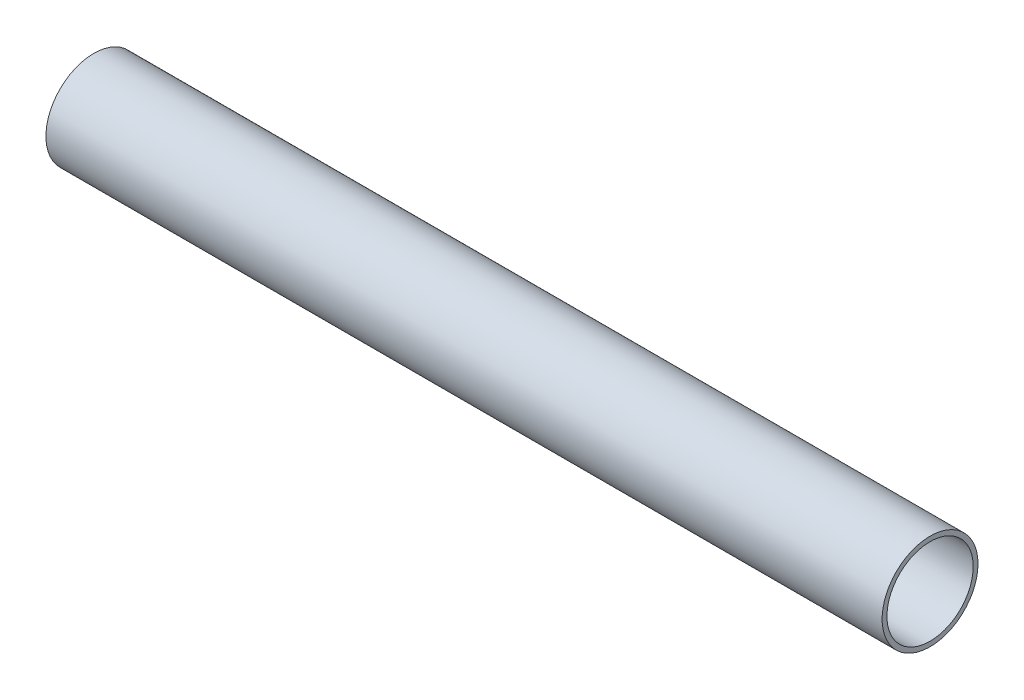
ISO-10303-21;
HEADER;
FILE_DESCRIPTION(('STEP AP214'),'2;1');
FILE_NAME('part.step','',(''),(''),'','','');
FILE_SCHEMA(('AUTOMOTIVE_DESIGN { 1 0 10303 214 1 1 1 1 }'));
ENDSEC;
DATA;
#1=APPLICATION_CONTEXT('core data for automotive mechanical design processes');
#2=APPLICATION_PROTOCOL_DEFINITION('international standard','automotive_design',2000,#1);
#3=PRODUCT_CONTEXT('',#1,'mechanical');
#4=PRODUCT('Part','Part','',(#3));
#5=PRODUCT_RELATED_PRODUCT_CATEGORY('part','',(#4));
#6=PRODUCT_DEFINITION_FORMATION('','',#4);
#7=PRODUCT_DEFINITION_CONTEXT('part definition',#1,'design');
#8=PRODUCT_DEFINITION('design','',#6,#7);
#9=PRODUCT_DEFINITION_SHAPE('','',#8);
#10=(LENGTH_UNIT() NAMED_UNIT(*) SI_UNIT(.MILLI.,.METRE.));
#11=(NAMED_UNIT(*) PLANE_ANGLE_UNIT() SI_UNIT($,.RADIAN.));
#12=(NAMED_UNIT(*) SI_UNIT($,.STERADIAN.) SOLID_ANGLE_UNIT());
#13=UNCERTAINTY_MEASURE_WITH_UNIT(LENGTH_MEASURE(1.E-05),#10,'distance_accuracy_value','');
#14=(GEOMETRIC_REPRESENTATION_CONTEXT(3) GLOBAL_UNCERTAINTY_ASSIGNED_CONTEXT((#13)) GLOBAL_UNIT_ASSIGNED_CONTEXT((#10,
#11,#12)) REPRESENTATION_CONTEXT('',''));
#15=CARTESIAN_POINT('',(0.,0.,0.));
#16=DIRECTION('',(0.,0.,1.));
#17=DIRECTION('',(1.,0.,0.));
#18=AXIS2_PLACEMENT_3D('',#15,#16,#17);
#19=CARTESIAN_POINT('',(138.463505902,0.,0.));
#20=DIRECTION('',(1.,0.,0.));
#21=DIRECTION('',(0.,0.,-1.));
#22=AXIS2_PLACEMENT_3D('',#19,#20,#21);
#23=PLANE('',#22);
#24=CARTESIAN_POINT('',(138.463505902,0.,0.));
#25=DIRECTION('',(1.,0.,0.));
#26=DIRECTION('',(0.,0.,-1.));
#27=AXIS2_PLACEMENT_3D('',#24,#25,#26);
#28=CIRCLE('',#27,15.875);
#29=CARTESIAN_POINT('',(138.463505902,0.,-15.875));
#30=VERTEX_POINT('',#29);
#31=EDGE_CURVE('E11',#30,#30,#28,.T.);
#32=ORIENTED_EDGE('',*,*,#31,.T.);
#33=EDGE_LOOP('',(#32));
#34=FACE_BOUND('',#33,.T.);
#35=CARTESIAN_POINT('',(138.463505902,0.,0.));
#36=DIRECTION('',(1.,0.,0.));
#37=DIRECTION('',(0.,0.,-1.));
#38=AXIS2_PLACEMENT_3D('',#35,#36,#37);
#39=CIRCLE('',#38,14.2875);
#40=CARTESIAN_POINT('',(138.463505902,0.,-14.2875));
#41=VERTEX_POINT('',#40);
#42=EDGE_CURVE('E58',#41,#41,#39,.T.);
#43=ORIENTED_EDGE('',*,*,#42,.F.);
#44=EDGE_LOOP('',(#43));
#45=FACE_BOUND('',#44,.T.);
#46=ADVANCED_FACE('F47',(#34,#45),#23,.T.);
#47=CARTESIAN_POINT('',(-138.463505902,0.,0.));
#48=DIRECTION('',(1.,0.,0.));
#49=DIRECTION('',(0.,0.,-1.));
#50=AXIS2_PLACEMENT_3D('',#47,#48,#49);
#51=PLANE('',#50);
#52=CARTESIAN_POINT('',(-138.463505902,0.,0.));
#53=DIRECTION('',(1.,0.,0.));
#54=DIRECTION('',(0.,0.,-1.));
#55=AXIS2_PLACEMENT_3D('',#52,#53,#54);
#56=CIRCLE('',#55,15.875);
#57=CARTESIAN_POINT('',(-138.463505902,0.,-15.875));
#58=VERTEX_POINT('',#57);
#59=EDGE_CURVE('E51',#58,#58,#56,.T.);
#60=ORIENTED_EDGE('',*,*,#59,.F.);
#61=EDGE_LOOP('',(#60));
#62=FACE_BOUND('',#61,.T.);
#63=CARTESIAN_POINT('',(-138.463505902,0.,0.));
#64=DIRECTION('',(1.,0.,0.));
#65=DIRECTION('',(0.,0.,-1.));
#66=AXIS2_PLACEMENT_3D('',#63,#64,#65);
#67=CIRCLE('',#66,14.2875);
#68=CARTESIAN_POINT('',(-138.463505902,0.,-14.2875));
#69=VERTEX_POINT('',#68);
#70=EDGE_CURVE('E60',#69,#69,#67,.T.);
#71=ORIENTED_EDGE('',*,*,#70,.T.);
#72=EDGE_LOOP('',(#71));
#73=FACE_BOUND('',#72,.T.);
#74=ADVANCED_FACE('F70',(#62,#73),#51,.F.);
#75=CARTESIAN_POINT('',(138.463505902,0.,0.));
#76=DIRECTION('',(-1.,0.,0.));
#77=DIRECTION('',(0.,0.,1.));
#78=AXIS2_PLACEMENT_3D('',#75,#76,#77);
#79=CYLINDRICAL_SURFACE('',#78,15.875);
#80=ORIENTED_EDGE('',*,*,#31,.F.);
#81=EDGE_LOOP('',(#80));
#82=FACE_BOUND('',#81,.T.);
#83=ORIENTED_EDGE('',*,*,#59,.T.);
#84=EDGE_LOOP('',(#83));
#85=FACE_BOUND('',#84,.T.);
#86=ADVANCED_FACE('F49',(#82,#85),#79,.T.);
#87=CARTESIAN_POINT('',(138.463505902,0.,0.));
#88=DIRECTION('',(-1.,0.,0.));
#89=DIRECTION('',(0.,0.,1.));
#90=AXIS2_PLACEMENT_3D('',#87,#88,#89);
#91=CYLINDRICAL_SURFACE('',#90,14.2875);
#92=ORIENTED_EDGE('',*,*,#42,.T.);
#93=EDGE_LOOP('',(#92));
#94=FACE_BOUND('',#93,.T.);
#95=ORIENTED_EDGE('',*,*,#70,.F.);
#96=EDGE_LOOP('',(#95));
#97=FACE_BOUND('',#96,.T.);
#98=ADVANCED_FACE('F66',(#94,#97),#91,.F.);
#99=CLOSED_SHELL('',(#46,#74,#86,#98));
#100=MANIFOLD_SOLID_BREP('B2',#99);
#101=ADVANCED_BREP_SHAPE_REPRESENTATION('',(#18,#100),#14);
#102=SHAPE_DEFINITION_REPRESENTATION(#9,#101);
ENDSEC;
END-ISO-10303-21;
